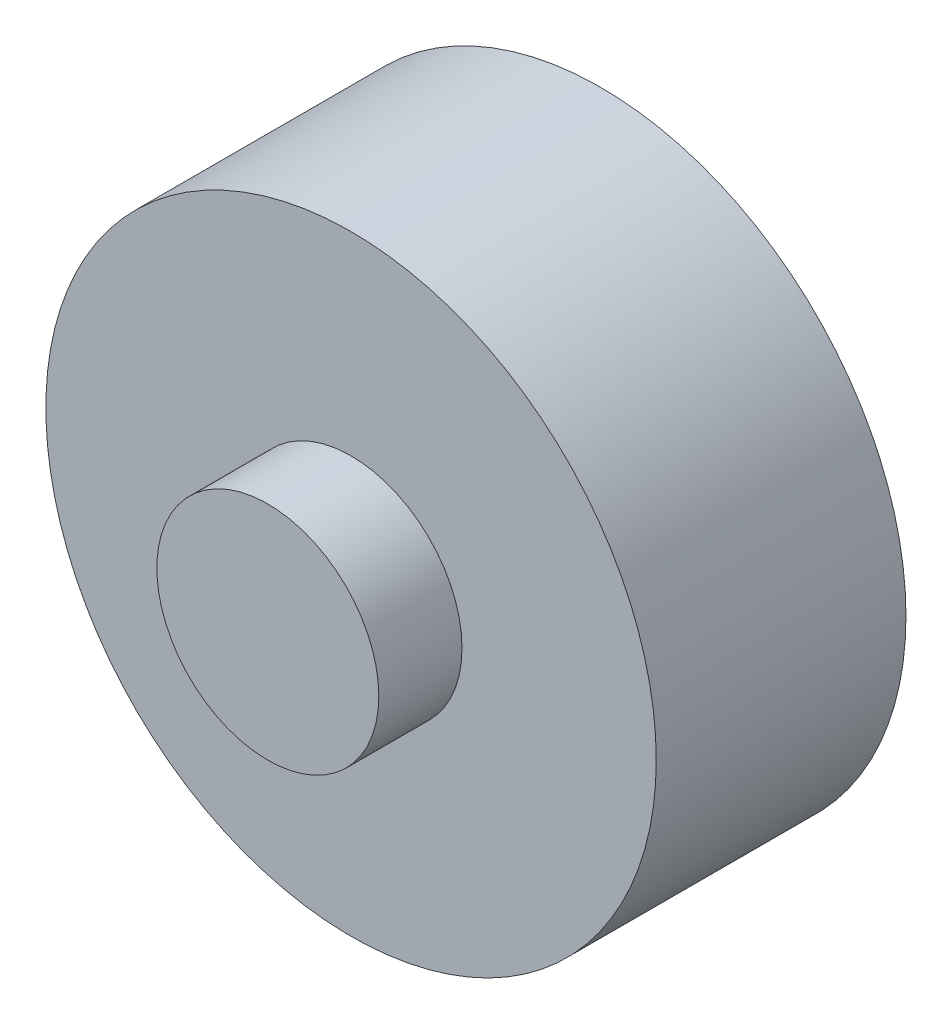
ISO-10303-21;
HEADER;
FILE_DESCRIPTION(('STEP AP214'),'2;1');
FILE_NAME('part.step','',(''),(''),'','','');
FILE_SCHEMA(('AUTOMOTIVE_DESIGN { 1 0 10303 214 1 1 1 1 }'));
ENDSEC;
DATA;
#1=APPLICATION_CONTEXT('core data for automotive mechanical design processes');
#2=APPLICATION_PROTOCOL_DEFINITION('international standard','automotive_design',2000,#1);
#3=PRODUCT_CONTEXT('',#1,'mechanical');
#4=PRODUCT('Part','Part','',(#3));
#5=PRODUCT_RELATED_PRODUCT_CATEGORY('part','',(#4));
#6=PRODUCT_DEFINITION_FORMATION('','',#4);
#7=PRODUCT_DEFINITION_CONTEXT('part definition',#1,'design');
#8=PRODUCT_DEFINITION('design','',#6,#7);
#9=PRODUCT_DEFINITION_SHAPE('','',#8);
#10=(LENGTH_UNIT() NAMED_UNIT(*) SI_UNIT(.MILLI.,.METRE.));
#11=(NAMED_UNIT(*) PLANE_ANGLE_UNIT() SI_UNIT($,.RADIAN.));
#12=(NAMED_UNIT(*) SI_UNIT($,.STERADIAN.) SOLID_ANGLE_UNIT());
#13=UNCERTAINTY_MEASURE_WITH_UNIT(LENGTH_MEASURE(1.E-05),#10,'distance_accuracy_value','');
#14=(GEOMETRIC_REPRESENTATION_CONTEXT(3) GLOBAL_UNCERTAINTY_ASSIGNED_CONTEXT((#13)) GLOBAL_UNIT_ASSIGNED_CONTEXT((#10,
#11,#12)) REPRESENTATION_CONTEXT('',''));
#15=CARTESIAN_POINT('',(0.,0.,0.));
#16=DIRECTION('',(0.,0.,1.));
#17=DIRECTION('',(1.,0.,0.));
#18=AXIS2_PLACEMENT_3D('',#15,#16,#17);
#19=CARTESIAN_POINT('',(0.,0.,24.));
#20=DIRECTION('',(0.,0.,-1.));
#21=DIRECTION('',(-1.,0.,0.));
#22=AXIS2_PLACEMENT_3D('',#19,#20,#21);
#23=CYLINDRICAL_SURFACE('',#22,8.);
#24=CARTESIAN_POINT('',(0.,0.,18.));
#25=DIRECTION('',(0.,0.,1.));
#26=DIRECTION('',(1.,0.,0.));
#27=AXIS2_PLACEMENT_3D('',#24,#25,#26);
#28=CIRCLE('',#27,8.);
#29=CARTESIAN_POINT('',(8.,0.,18.));
#30=VERTEX_POINT('',#29);
#31=EDGE_CURVE('E40',#30,#30,#28,.T.);
#32=ORIENTED_EDGE('',*,*,#31,.T.);
#33=EDGE_LOOP('',(#32));
#34=FACE_BOUND('',#33,.T.);
#35=CARTESIAN_POINT('',(0.,0.,24.));
#36=DIRECTION('',(0.,0.,1.));
#37=DIRECTION('',(1.,0.,0.));
#38=AXIS2_PLACEMENT_3D('',#35,#36,#37);
#39=CIRCLE('',#38,8.);
#40=CARTESIAN_POINT('',(8.,0.,24.));
#41=VERTEX_POINT('',#40);
#42=EDGE_CURVE('E10',#41,#41,#39,.T.);
#43=ORIENTED_EDGE('',*,*,#42,.F.);
#44=EDGE_LOOP('',(#43));
#45=FACE_BOUND('',#44,.T.);
#46=ADVANCED_FACE('F37',(#34,#45),#23,.T.);
#47=CARTESIAN_POINT('',(0.,0.,24.));
#48=DIRECTION('',(0.,0.,1.));
#49=DIRECTION('',(1.,0.,0.));
#50=AXIS2_PLACEMENT_3D('',#47,#48,#49);
#51=PLANE('',#50);
#52=ORIENTED_EDGE('',*,*,#42,.T.);
#53=EDGE_LOOP('',(#52));
#54=FACE_BOUND('',#53,.T.);
#55=ADVANCED_FACE('F60',(#54),#51,.T.);
#56=CARTESIAN_POINT('',(0.,0.,18.));
#57=DIRECTION('',(0.,0.,-1.));
#58=DIRECTION('',(-1.,0.,0.));
#59=AXIS2_PLACEMENT_3D('',#56,#57,#58);
#60=CYLINDRICAL_SURFACE('',#59,22.);
#61=CARTESIAN_POINT('',(0.,0.,18.));
#62=DIRECTION('',(0.,0.,1.));
#63=DIRECTION('',(1.,0.,0.));
#64=AXIS2_PLACEMENT_3D('',#61,#62,#63);
#65=CIRCLE('',#64,22.);
#66=CARTESIAN_POINT('',(22.,0.,18.));
#67=VERTEX_POINT('',#66);
#68=EDGE_CURVE('E47',#67,#67,#65,.T.);
#69=ORIENTED_EDGE('',*,*,#68,.F.);
#70=EDGE_LOOP('',(#69));
#71=FACE_BOUND('',#70,.T.);
#72=CARTESIAN_POINT('',(0.,0.,0.));
#73=DIRECTION('',(0.,0.,1.));
#74=DIRECTION('',(1.,0.,0.));
#75=AXIS2_PLACEMENT_3D('',#72,#73,#74);
#76=CIRCLE('',#75,22.);
#77=CARTESIAN_POINT('',(22.,0.,0.));
#78=VERTEX_POINT('',#77);
#79=EDGE_CURVE('E49',#78,#78,#76,.T.);
#80=ORIENTED_EDGE('',*,*,#79,.T.);
#81=EDGE_LOOP('',(#80));
#82=FACE_BOUND('',#81,.T.);
#83=ADVANCED_FACE('F57',(#71,#82),#60,.T.);
#84=CARTESIAN_POINT('',(0.,0.,18.));
#85=DIRECTION('',(0.,0.,1.));
#86=DIRECTION('',(1.,0.,0.));
#87=AXIS2_PLACEMENT_3D('',#84,#85,#86);
#88=PLANE('',#87);
#89=ORIENTED_EDGE('',*,*,#31,.F.);
#90=EDGE_LOOP('',(#89));
#91=FACE_BOUND('',#90,.T.);
#92=ORIENTED_EDGE('',*,*,#68,.T.);
#93=EDGE_LOOP('',(#92));
#94=FACE_BOUND('',#93,.T.);
#95=ADVANCED_FACE('F55',(#91,#94),#88,.T.);
#96=CARTESIAN_POINT('',(0.,0.,0.));
#97=DIRECTION('',(0.,0.,1.));
#98=DIRECTION('',(1.,0.,0.));
#99=AXIS2_PLACEMENT_3D('',#96,#97,#98);
#100=PLANE('',#99);
#101=ORIENTED_EDGE('',*,*,#79,.F.);
#102=EDGE_LOOP('',(#101));
#103=FACE_BOUND('',#102,.T.);
#104=ADVANCED_FACE('F64',(#103),#100,.F.);
#105=CLOSED_SHELL('',(#46,#55,#83,#95,#104));
#106=MANIFOLD_SOLID_BREP('B2',#105);
#107=ADVANCED_BREP_SHAPE_REPRESENTATION('',(#18,#106),#14);
#108=SHAPE_DEFINITION_REPRESENTATION(#9,#107);
ENDSEC;
END-ISO-10303-21;
